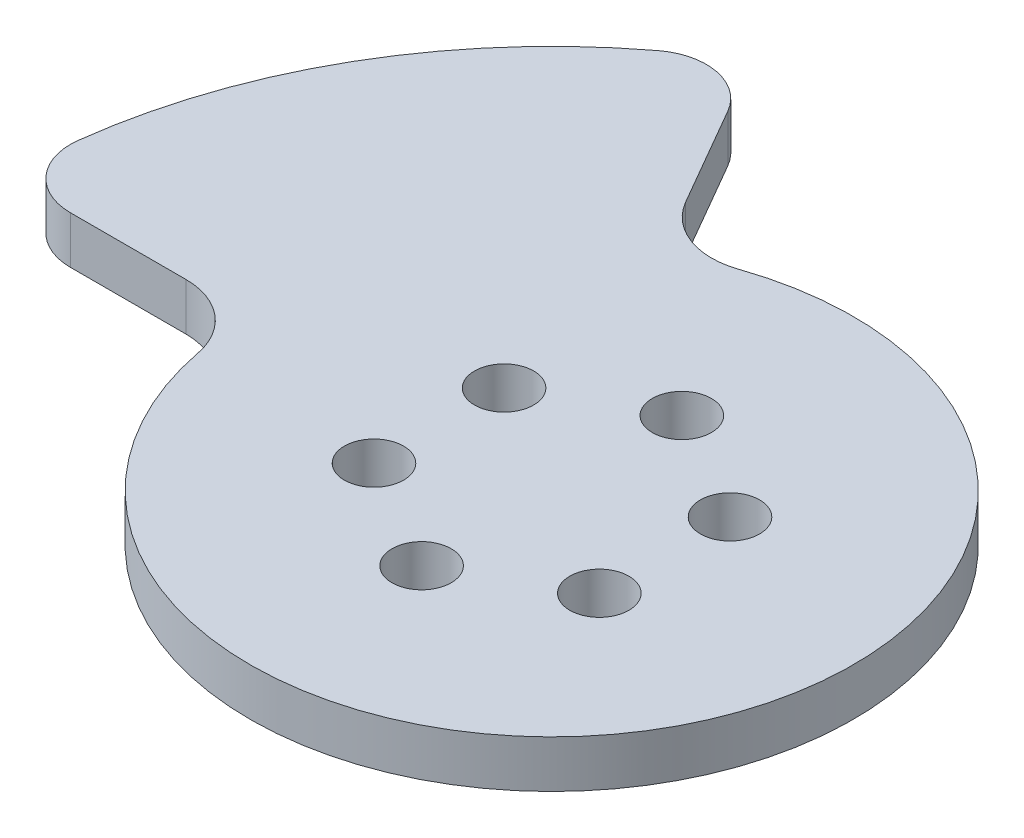
ISO-10303-21;
HEADER;
FILE_DESCRIPTION(('STEP AP214'),'2;1');
FILE_NAME('part.step','',(''),(''),'','','');
FILE_SCHEMA(('AUTOMOTIVE_DESIGN { 1 0 10303 214 1 1 1 1 }'));
ENDSEC;
DATA;
#1=APPLICATION_CONTEXT('core data for automotive mechanical design processes');
#2=APPLICATION_PROTOCOL_DEFINITION('international standard','automotive_design',2000,#1);
#3=PRODUCT_CONTEXT('',#1,'mechanical');
#4=PRODUCT('Part','Part','',(#3));
#5=PRODUCT_RELATED_PRODUCT_CATEGORY('part','',(#4));
#6=PRODUCT_DEFINITION_FORMATION('','',#4);
#7=PRODUCT_DEFINITION_CONTEXT('part definition',#1,'design');
#8=PRODUCT_DEFINITION('design','',#6,#7);
#9=PRODUCT_DEFINITION_SHAPE('','',#8);
#10=(LENGTH_UNIT() NAMED_UNIT(*) SI_UNIT(.MILLI.,.METRE.));
#11=(NAMED_UNIT(*) PLANE_ANGLE_UNIT() SI_UNIT($,.RADIAN.));
#12=(NAMED_UNIT(*) SI_UNIT($,.STERADIAN.) SOLID_ANGLE_UNIT());
#13=UNCERTAINTY_MEASURE_WITH_UNIT(LENGTH_MEASURE(1.E-05),#10,'distance_accuracy_value','');
#14=(GEOMETRIC_REPRESENTATION_CONTEXT(3) GLOBAL_UNCERTAINTY_ASSIGNED_CONTEXT((#13)) GLOBAL_UNIT_ASSIGNED_CONTEXT((#10,
#11,#12)) REPRESENTATION_CONTEXT('',''));
#15=CARTESIAN_POINT('',(0.,0.,0.));
#16=DIRECTION('',(0.,0.,1.));
#17=DIRECTION('',(1.,0.,0.));
#18=AXIS2_PLACEMENT_3D('',#15,#16,#17);
#19=CARTESIAN_POINT('',(-30.9232921921325,4.,6.));
#20=DIRECTION('',(0.,1.,0.));
#21=DIRECTION('',(0.,0.,1.));
#22=AXIS2_PLACEMENT_3D('',#19,#20,#21);
#23=PLANE('',#22);
#24=CARTESIAN_POINT('',(-9.52627944162788,4.,5.4999999999999));
#25=DIRECTION('',(0.,1.,0.));
#26=DIRECTION('',(0.,0.,1.));
#27=AXIS2_PLACEMENT_3D('',#24,#25,#26);
#28=CIRCLE('',#27,2.5);
#29=CARTESIAN_POINT('',(-9.52627944162788,4.,7.9999999999999));
#30=VERTEX_POINT('',#29);
#31=EDGE_CURVE('E237',#30,#30,#28,.T.);
#32=ORIENTED_EDGE('',*,*,#31,.F.);
#33=EDGE_LOOP('',(#32));
#34=FACE_BOUND('',#33,.T.);
#35=CARTESIAN_POINT('',(9.52627944162977,4.,5.4999999999999));
#36=DIRECTION('',(0.,1.,0.));
#37=DIRECTION('',(0.,0.,1.));
#38=AXIS2_PLACEMENT_3D('',#35,#36,#37);
#39=CIRCLE('',#38,2.5);
#40=CARTESIAN_POINT('',(9.52627944162977,4.,7.9999999999999));
#41=VERTEX_POINT('',#40);
#42=EDGE_CURVE('E221',#41,#41,#39,.T.);
#43=ORIENTED_EDGE('',*,*,#42,.F.);
#44=EDGE_LOOP('',(#43));
#45=FACE_BOUND('',#44,.T.);
#46=CARTESIAN_POINT('',(9.46206301637637,4.,-5.60975609756097));
#47=DIRECTION('',(0.,1.,0.));
#48=DIRECTION('',(0.,0.,1.));
#49=AXIS2_PLACEMENT_3D('',#46,#47,#48);
#50=CIRCLE('',#49,2.5);
#51=CARTESIAN_POINT('',(9.46206301637637,4.,-3.10975609756097));
#52=VERTEX_POINT('',#51);
#53=EDGE_CURVE('E146',#52,#52,#50,.T.);
#54=ORIENTED_EDGE('',*,*,#53,.F.);
#55=EDGE_LOOP('',(#54));
#56=FACE_BOUND('',#55,.T.);
#57=CARTESIAN_POINT('',(-30.9232921921325,4.,6.));
#58=DIRECTION('',(0.,-1.,0.));
#59=DIRECTION('',(0.,0.,1.));
#60=AXIS2_PLACEMENT_3D('',#57,#58,#59);
#61=CIRCLE('',#60,6.);
#62=CARTESIAN_POINT('',(-30.9232921921325,4.,0.));
#63=VERTEX_POINT('',#62);
#64=CARTESIAN_POINT('',(-25.0331412983929,4.,4.85714285714287));
#65=VERTEX_POINT('',#64);
#66=EDGE_CURVE('E164',#63,#65,#61,.T.);
#67=ORIENTED_EDGE('',*,*,#66,.T.);
#68=CARTESIAN_POINT('',(0.,4.,0.));
#69=DIRECTION('',(0.,1.,0.));
#70=DIRECTION('',(0.,0.,-1.));
#71=AXIS2_PLACEMENT_3D('',#68,#69,#70);
#72=CIRCLE('',#71,25.5);
#73=CARTESIAN_POINT('',(-8.31016154510075,4.,-24.107907729505));
#74=VERTEX_POINT('',#73);
#75=EDGE_CURVE('E100',#65,#74,#72,.T.);
#76=ORIENTED_EDGE('',*,*,#75,.T.);
#77=CARTESIAN_POINT('',(-10.2654936733598,4.,-29.7803566070356));
#78=DIRECTION('',(0.,-1.,0.));
#79=DIRECTION('',(0.,0.,-1.));
#80=AXIS2_PLACEMENT_3D('',#77,#78,#79);
#81=CIRCLE('',#80,6.);
#82=CARTESIAN_POINT('',(-15.4616460960664,4.,-26.7803566070356));
#83=VERTEX_POINT('',#82);
#84=EDGE_CURVE('E185',#74,#83,#81,.T.);
#85=ORIENTED_EDGE('',*,*,#84,.T.);
#86=DIRECTION('',(-0.500000000000004,0.,-0.866025403784436));
#87=VECTOR('',#86,1.);
#88=CARTESIAN_POINT('',(-20.346989949376,4.,-35.2420203734121));
#89=LINE('',#88,#87);
#90=CARTESIAN_POINT('',(-20.346989949376,4.,-35.2420203734121));
#91=VERTEX_POINT('',#90);
#92=EDGE_CURVE('E199',#83,#91,#89,.T.);
#93=ORIENTED_EDGE('',*,*,#92,.T.);
#94=CARTESIAN_POINT('',(-24.6771169682982,4.,-32.7420203734121));
#95=DIRECTION('',(0.,1.,0.));
#96=DIRECTION('',(0.,0.,-1.));
#97=AXIS2_PLACEMENT_3D('',#94,#95,#96);
#98=CIRCLE('',#97,5.);
#99=CARTESIAN_POINT('',(-27.6865214766272,4.,-36.7349496872428));
#100=VERTEX_POINT('',#99);
#101=EDGE_CURVE('E119',#91,#100,#98,.T.);
#102=ORIENTED_EDGE('',*,*,#101,.T.);
#103=CARTESIAN_POINT('',(9.5062846483529E-13,4.,0.));
#104=DIRECTION('',(0.,1.,0.));
#105=DIRECTION('',(0.,0.,1.));
#106=AXIS2_PLACEMENT_3D('',#103,#104,#105);
#107=CIRCLE('',#106,46.0000000000007);
#108=CARTESIAN_POINT('',(-45.6566603742089,4.,-5.60975609756097));
#109=VERTEX_POINT('',#108);
#110=EDGE_CURVE('E113',#100,#109,#107,.T.);
#111=ORIENTED_EDGE('',*,*,#110,.T.);
#112=CARTESIAN_POINT('',(-40.6939798987516,4.,-5.));
#113=DIRECTION('',(0.,1.,0.));
#114=DIRECTION('',(0.,0.,1.));
#115=AXIS2_PLACEMENT_3D('',#112,#113,#114);
#116=CIRCLE('',#115,4.99999999999999);
#117=CARTESIAN_POINT('',(-40.6939798987516,4.,0.));
#118=VERTEX_POINT('',#117);
#119=EDGE_CURVE('E117',#109,#118,#116,.T.);
#120=ORIENTED_EDGE('',*,*,#119,.T.);
#121=DIRECTION('',(1.,0.,0.));
#122=VECTOR('',#121,1.);
#123=CARTESIAN_POINT('',(-30.9232921921325,4.,0.));
#124=LINE('',#123,#122);
#125=EDGE_CURVE('E57',#118,#63,#124,.T.);
#126=ORIENTED_EDGE('',*,*,#125,.T.);
#127=EDGE_LOOP('',(#67,#76,#85,#93,#102,#111,#120,#126));
#128=FACE_BOUND('',#127,.T.);
#129=CARTESIAN_POINT('',(9.4542429440736E-13,4.,-11.0000000000001));
#130=DIRECTION('',(0.,1.,0.));
#131=DIRECTION('',(0.,0.,1.));
#132=AXIS2_PLACEMENT_3D('',#129,#130,#131);
#133=CIRCLE('',#132,2.5);
#134=CARTESIAN_POINT('',(9.4542429440736E-13,4.,-8.5000000000001));
#135=VERTEX_POINT('',#134);
#136=EDGE_CURVE('E213',#135,#135,#133,.T.);
#137=ORIENTED_EDGE('',*,*,#136,.F.);
#138=EDGE_LOOP('',(#137));
#139=FACE_BOUND('',#138,.T.);
#140=CARTESIAN_POINT('',(9.42948691115118E-13,4.,10.9999999999999));
#141=DIRECTION('',(0.,1.,0.));
#142=DIRECTION('',(0.,0.,1.));
#143=AXIS2_PLACEMENT_3D('',#140,#141,#142);
#144=CIRCLE('',#143,2.5);
#145=CARTESIAN_POINT('',(9.42948691115118E-13,4.,13.4999999999999));
#146=VERTEX_POINT('',#145);
#147=EDGE_CURVE('E229',#146,#146,#144,.T.);
#148=ORIENTED_EDGE('',*,*,#147,.F.);
#149=EDGE_LOOP('',(#148));
#150=FACE_BOUND('',#149,.T.);
#151=CARTESIAN_POINT('',(-9.52627944162788,4.,-5.5000000000001));
#152=DIRECTION('',(0.,1.,0.));
#153=DIRECTION('',(0.,0.,1.));
#154=AXIS2_PLACEMENT_3D('',#151,#152,#153);
#155=CIRCLE('',#154,2.5);
#156=CARTESIAN_POINT('',(-9.52627944162788,4.,-3.0000000000001));
#157=VERTEX_POINT('',#156);
#158=EDGE_CURVE('E245',#157,#157,#155,.T.);
#159=ORIENTED_EDGE('',*,*,#158,.F.);
#160=EDGE_LOOP('',(#159));
#161=FACE_BOUND('',#160,.T.);
#162=ADVANCED_FACE('F39',(#34,#45,#56,#128,#139,#150,#161),#23,.T.);
#163=CARTESIAN_POINT('',(-30.9232921921325,0.,6.));
#164=DIRECTION('',(0.,1.,0.));
#165=DIRECTION('',(0.,0.,1.));
#166=AXIS2_PLACEMENT_3D('',#163,#164,#165);
#167=PLANE('',#166);
#168=CARTESIAN_POINT('',(-30.9232921921325,0.,6.));
#169=DIRECTION('',(0.,-1.,0.));
#170=DIRECTION('',(0.,0.,1.));
#171=AXIS2_PLACEMENT_3D('',#168,#169,#170);
#172=CIRCLE('',#171,6.);
#173=CARTESIAN_POINT('',(-30.9232921921325,0.,0.));
#174=VERTEX_POINT('',#173);
#175=CARTESIAN_POINT('',(-25.0331412983929,0.,4.85714285714287));
#176=VERTEX_POINT('',#175);
#177=EDGE_CURVE('E141',#174,#176,#172,.T.);
#178=ORIENTED_EDGE('',*,*,#177,.F.);
#179=DIRECTION('',(1.,0.,0.));
#180=VECTOR('',#179,1.);
#181=CARTESIAN_POINT('',(-30.9232921921325,0.,0.));
#182=LINE('',#181,#180);
#183=CARTESIAN_POINT('',(-40.6939798987516,0.,0.));
#184=VERTEX_POINT('',#183);
#185=EDGE_CURVE('E92',#184,#174,#182,.T.);
#186=ORIENTED_EDGE('',*,*,#185,.F.);
#187=CARTESIAN_POINT('',(-40.6939798987516,0.,-5.));
#188=DIRECTION('',(0.,1.,0.));
#189=DIRECTION('',(0.,0.,1.));
#190=AXIS2_PLACEMENT_3D('',#187,#188,#189);
#191=CIRCLE('',#190,4.99999999999999);
#192=CARTESIAN_POINT('',(-45.6566603742089,0.,-5.60975609756097));
#193=VERTEX_POINT('',#192);
#194=EDGE_CURVE('E86',#193,#184,#191,.T.);
#195=ORIENTED_EDGE('',*,*,#194,.F.);
#196=CARTESIAN_POINT('',(9.5062846483529E-13,0.,0.));
#197=DIRECTION('',(0.,1.,0.));
#198=DIRECTION('',(0.,0.,1.));
#199=AXIS2_PLACEMENT_3D('',#196,#197,#198);
#200=CIRCLE('',#199,46.0000000000007);
#201=CARTESIAN_POINT('',(-27.6865214766272,0.,-36.7349496872428));
#202=VERTEX_POINT('',#201);
#203=EDGE_CURVE('E128',#202,#193,#200,.T.);
#204=ORIENTED_EDGE('',*,*,#203,.F.);
#205=CARTESIAN_POINT('',(-24.6771169682982,0.,-32.7420203734121));
#206=DIRECTION('',(0.,1.,0.));
#207=DIRECTION('',(0.,0.,-1.));
#208=AXIS2_PLACEMENT_3D('',#205,#206,#207);
#209=CIRCLE('',#208,5.);
#210=CARTESIAN_POINT('',(-20.346989949376,0.,-35.2420203734121));
#211=VERTEX_POINT('',#210);
#212=EDGE_CURVE('E155',#211,#202,#209,.T.);
#213=ORIENTED_EDGE('',*,*,#212,.F.);
#214=DIRECTION('',(-0.500000000000004,0.,-0.866025403784436));
#215=VECTOR('',#214,1.);
#216=CARTESIAN_POINT('',(-20.346989949376,0.,-35.2420203734121));
#217=LINE('',#216,#215);
#218=CARTESIAN_POINT('',(-15.4616460960664,0.,-26.7803566070356));
#219=VERTEX_POINT('',#218);
#220=EDGE_CURVE('E152',#219,#211,#217,.T.);
#221=ORIENTED_EDGE('',*,*,#220,.F.);
#222=CARTESIAN_POINT('',(-10.2654936733598,0.,-29.7803566070356));
#223=DIRECTION('',(0.,-1.,0.));
#224=DIRECTION('',(0.,0.,-1.));
#225=AXIS2_PLACEMENT_3D('',#222,#223,#224);
#226=CIRCLE('',#225,6.);
#227=CARTESIAN_POINT('',(-8.31016154510075,0.,-24.107907729505));
#228=VERTEX_POINT('',#227);
#229=EDGE_CURVE('E149',#228,#219,#226,.T.);
#230=ORIENTED_EDGE('',*,*,#229,.F.);
#231=CARTESIAN_POINT('',(0.,0.,0.));
#232=DIRECTION('',(0.,1.,0.));
#233=DIRECTION('',(0.,0.,-1.));
#234=AXIS2_PLACEMENT_3D('',#231,#232,#233);
#235=CIRCLE('',#234,25.5);
#236=EDGE_CURVE('E145',#176,#228,#235,.T.);
#237=ORIENTED_EDGE('',*,*,#236,.F.);
#238=EDGE_LOOP('',(#178,#186,#195,#204,#213,#221,#230,#237));
#239=FACE_BOUND('',#238,.T.);
#240=CARTESIAN_POINT('',(9.46206301637637,0.,-5.60975609756097));
#241=DIRECTION('',(0.,1.,0.));
#242=DIRECTION('',(0.,0.,1.));
#243=AXIS2_PLACEMENT_3D('',#240,#241,#242);
#244=CIRCLE('',#243,2.5);
#245=CARTESIAN_POINT('',(9.46206301637637,0.,-3.10975609756097));
#246=VERTEX_POINT('',#245);
#247=EDGE_CURVE('E209',#246,#246,#244,.T.);
#248=ORIENTED_EDGE('',*,*,#247,.T.);
#249=EDGE_LOOP('',(#248));
#250=FACE_BOUND('',#249,.T.);
#251=CARTESIAN_POINT('',(9.4542429440736E-13,0.,-11.0000000000001));
#252=DIRECTION('',(0.,1.,0.));
#253=DIRECTION('',(0.,0.,1.));
#254=AXIS2_PLACEMENT_3D('',#251,#252,#253);
#255=CIRCLE('',#254,2.5);
#256=CARTESIAN_POINT('',(9.4542429440736E-13,0.,-8.5000000000001));
#257=VERTEX_POINT('',#256);
#258=EDGE_CURVE('E217',#257,#257,#255,.T.);
#259=ORIENTED_EDGE('',*,*,#258,.T.);
#260=EDGE_LOOP('',(#259));
#261=FACE_BOUND('',#260,.T.);
#262=CARTESIAN_POINT('',(9.52627944162977,0.,5.4999999999999));
#263=DIRECTION('',(0.,1.,0.));
#264=DIRECTION('',(0.,0.,1.));
#265=AXIS2_PLACEMENT_3D('',#262,#263,#264);
#266=CIRCLE('',#265,2.5);
#267=CARTESIAN_POINT('',(9.52627944162977,0.,7.9999999999999));
#268=VERTEX_POINT('',#267);
#269=EDGE_CURVE('E225',#268,#268,#266,.T.);
#270=ORIENTED_EDGE('',*,*,#269,.T.);
#271=EDGE_LOOP('',(#270));
#272=FACE_BOUND('',#271,.T.);
#273=CARTESIAN_POINT('',(9.42948691115118E-13,0.,10.9999999999999));
#274=DIRECTION('',(0.,1.,0.));
#275=DIRECTION('',(0.,0.,1.));
#276=AXIS2_PLACEMENT_3D('',#273,#274,#275);
#277=CIRCLE('',#276,2.5);
#278=CARTESIAN_POINT('',(9.42948691115118E-13,0.,13.4999999999999));
#279=VERTEX_POINT('',#278);
#280=EDGE_CURVE('E233',#279,#279,#277,.T.);
#281=ORIENTED_EDGE('',*,*,#280,.T.);
#282=EDGE_LOOP('',(#281));
#283=FACE_BOUND('',#282,.T.);
#284=CARTESIAN_POINT('',(-9.52627944162788,0.,5.4999999999999));
#285=DIRECTION('',(0.,1.,0.));
#286=DIRECTION('',(0.,0.,1.));
#287=AXIS2_PLACEMENT_3D('',#284,#285,#286);
#288=CIRCLE('',#287,2.5);
#289=CARTESIAN_POINT('',(-9.52627944162788,0.,7.9999999999999));
#290=VERTEX_POINT('',#289);
#291=EDGE_CURVE('E241',#290,#290,#288,.T.);
#292=ORIENTED_EDGE('',*,*,#291,.T.);
#293=EDGE_LOOP('',(#292));
#294=FACE_BOUND('',#293,.T.);
#295=CARTESIAN_POINT('',(-9.52627944162788,0.,-5.5000000000001));
#296=DIRECTION('',(0.,1.,0.));
#297=DIRECTION('',(0.,0.,1.));
#298=AXIS2_PLACEMENT_3D('',#295,#296,#297);
#299=CIRCLE('',#298,2.5);
#300=CARTESIAN_POINT('',(-9.52627944162788,0.,-3.0000000000001));
#301=VERTEX_POINT('',#300);
#302=EDGE_CURVE('E249',#301,#301,#299,.T.);
#303=ORIENTED_EDGE('',*,*,#302,.T.);
#304=EDGE_LOOP('',(#303));
#305=FACE_BOUND('',#304,.T.);
#306=ADVANCED_FACE('F189',(#239,#250,#261,#272,#283,#294,#305),#167,.F.);
#307=CARTESIAN_POINT('',(-30.9232921921325,4.,6.));
#308=DIRECTION('',(0.,-1.,0.));
#309=DIRECTION('',(0.,0.,-1.));
#310=AXIS2_PLACEMENT_3D('',#307,#308,#309);
#311=CYLINDRICAL_SURFACE('',#310,6.);
#312=ORIENTED_EDGE('',*,*,#177,.T.);
#313=DIRECTION('',(0.,-1.,0.));
#314=VECTOR('',#313,1.);
#315=CARTESIAN_POINT('',(-25.0331412983929,4.,4.85714285714287));
#316=LINE('',#315,#314);
#317=EDGE_CURVE('E11',#65,#176,#316,.T.);
#318=ORIENTED_EDGE('',*,*,#317,.F.);
#319=ORIENTED_EDGE('',*,*,#66,.F.);
#320=DIRECTION('',(0.,-1.,0.));
#321=VECTOR('',#320,1.);
#322=CARTESIAN_POINT('',(-30.9232921921325,4.,0.));
#323=LINE('',#322,#321);
#324=EDGE_CURVE('E137',#63,#174,#323,.T.);
#325=ORIENTED_EDGE('',*,*,#324,.T.);
#326=EDGE_LOOP('',(#312,#318,#319,#325));
#327=FACE_BOUND('',#326,.T.);
#328=ADVANCED_FACE('F41',(#327),#311,.F.);
#329=CARTESIAN_POINT('',(0.,4.,0.));
#330=DIRECTION('',(0.,-1.,0.));
#331=DIRECTION('',(0.,0.,-1.));
#332=AXIS2_PLACEMENT_3D('',#329,#330,#331);
#333=CYLINDRICAL_SURFACE('',#332,25.5);
#334=ORIENTED_EDGE('',*,*,#236,.T.);
#335=DIRECTION('',(0.,-1.,0.));
#336=VECTOR('',#335,1.);
#337=CARTESIAN_POINT('',(-8.31016154510075,4.,-24.107907729505));
#338=LINE('',#337,#336);
#339=EDGE_CURVE('E49',#74,#228,#338,.T.);
#340=ORIENTED_EDGE('',*,*,#339,.F.);
#341=ORIENTED_EDGE('',*,*,#75,.F.);
#342=ORIENTED_EDGE('',*,*,#317,.T.);
#343=EDGE_LOOP('',(#334,#340,#341,#342));
#344=FACE_BOUND('',#343,.T.);
#345=ADVANCED_FACE('F285',(#344),#333,.T.);
#346=CARTESIAN_POINT('',(-10.2654936733598,4.,-29.7803566070356));
#347=DIRECTION('',(0.,-1.,0.));
#348=DIRECTION('',(0.,0.,-1.));
#349=AXIS2_PLACEMENT_3D('',#346,#347,#348);
#350=CYLINDRICAL_SURFACE('',#349,6.);
#351=ORIENTED_EDGE('',*,*,#229,.T.);
#352=DIRECTION('',(0.,-1.,0.));
#353=VECTOR('',#352,1.);
#354=CARTESIAN_POINT('',(-15.4616460960664,4.,-26.7803566070356));
#355=LINE('',#354,#353);
#356=EDGE_CURVE('E175',#83,#219,#355,.T.);
#357=ORIENTED_EDGE('',*,*,#356,.F.);
#358=ORIENTED_EDGE('',*,*,#84,.F.);
#359=ORIENTED_EDGE('',*,*,#339,.T.);
#360=EDGE_LOOP('',(#351,#357,#358,#359));
#361=FACE_BOUND('',#360,.T.);
#362=ADVANCED_FACE('F183',(#361),#350,.F.);
#363=CARTESIAN_POINT('',(-20.346989949376,4.,-35.2420203734121));
#364=DIRECTION('',(-0.866025403784436,0.,0.500000000000004));
#365=DIRECTION('',(0.500000000000004,0.,0.866025403784436));
#366=AXIS2_PLACEMENT_3D('',#363,#364,#365);
#367=PLANE('',#366);
#368=ORIENTED_EDGE('',*,*,#220,.T.);
#369=DIRECTION('',(0.,-1.,0.));
#370=VECTOR('',#369,1.);
#371=CARTESIAN_POINT('',(-20.346989949376,4.,-35.2420203734121));
#372=LINE('',#371,#370);
#373=EDGE_CURVE('E171',#91,#211,#372,.T.);
#374=ORIENTED_EDGE('',*,*,#373,.F.);
#375=ORIENTED_EDGE('',*,*,#92,.F.);
#376=ORIENTED_EDGE('',*,*,#356,.T.);
#377=EDGE_LOOP('',(#368,#374,#375,#376));
#378=FACE_BOUND('',#377,.T.);
#379=ADVANCED_FACE('F194',(#378),#367,.F.);
#380=CARTESIAN_POINT('',(-24.6771169682982,4.,-32.7420203734121));
#381=DIRECTION('',(0.,-1.,0.));
#382=DIRECTION('',(0.,0.,-1.));
#383=AXIS2_PLACEMENT_3D('',#380,#381,#382);
#384=CYLINDRICAL_SURFACE('',#383,5.);
#385=ORIENTED_EDGE('',*,*,#212,.T.);
#386=DIRECTION('',(0.,-1.,0.));
#387=VECTOR('',#386,1.);
#388=CARTESIAN_POINT('',(-27.6865214766272,4.,-36.7349496872428));
#389=LINE('',#388,#387);
#390=EDGE_CURVE('E130',#100,#202,#389,.T.);
#391=ORIENTED_EDGE('',*,*,#390,.F.);
#392=ORIENTED_EDGE('',*,*,#101,.F.);
#393=ORIENTED_EDGE('',*,*,#373,.T.);
#394=EDGE_LOOP('',(#385,#391,#392,#393));
#395=FACE_BOUND('',#394,.T.);
#396=ADVANCED_FACE('F197',(#395),#384,.T.);
#397=CARTESIAN_POINT('',(9.5062846483529E-13,4.,0.));
#398=DIRECTION('',(0.,-1.,0.));
#399=DIRECTION('',(0.,0.,-1.));
#400=AXIS2_PLACEMENT_3D('',#397,#398,#399);
#401=CYLINDRICAL_SURFACE('',#400,46.0000000000007);
#402=ORIENTED_EDGE('',*,*,#203,.T.);
#403=DIRECTION('',(0.,-1.,0.));
#404=VECTOR('',#403,1.);
#405=CARTESIAN_POINT('',(-45.6566603742089,4.,-5.60975609756097));
#406=LINE('',#405,#404);
#407=EDGE_CURVE('E125',#109,#193,#406,.T.);
#408=ORIENTED_EDGE('',*,*,#407,.F.);
#409=ORIENTED_EDGE('',*,*,#110,.F.);
#410=ORIENTED_EDGE('',*,*,#390,.T.);
#411=EDGE_LOOP('',(#402,#408,#409,#410));
#412=FACE_BOUND('',#411,.T.);
#413=ADVANCED_FACE('F126',(#412),#401,.T.);
#414=CARTESIAN_POINT('',(-40.6939798987516,4.,-5.));
#415=DIRECTION('',(0.,-1.,0.));
#416=DIRECTION('',(0.,0.,-1.));
#417=AXIS2_PLACEMENT_3D('',#414,#415,#416);
#418=CYLINDRICAL_SURFACE('',#417,4.99999999999999);
#419=ORIENTED_EDGE('',*,*,#194,.T.);
#420=DIRECTION('',(0.,-1.,0.));
#421=VECTOR('',#420,1.);
#422=CARTESIAN_POINT('',(-40.6939798987516,4.,0.));
#423=LINE('',#422,#421);
#424=EDGE_CURVE('E131',#118,#184,#423,.T.);
#425=ORIENTED_EDGE('',*,*,#424,.F.);
#426=ORIENTED_EDGE('',*,*,#119,.F.);
#427=ORIENTED_EDGE('',*,*,#407,.T.);
#428=EDGE_LOOP('',(#419,#425,#426,#427));
#429=FACE_BOUND('',#428,.T.);
#430=ADVANCED_FACE('F133',(#429),#418,.T.);
#431=CARTESIAN_POINT('',(-30.9232921921325,4.,0.));
#432=DIRECTION('',(0.,0.,-1.));
#433=DIRECTION('',(-1.,0.,0.));
#434=AXIS2_PLACEMENT_3D('',#431,#432,#433);
#435=PLANE('',#434);
#436=ORIENTED_EDGE('',*,*,#185,.T.);
#437=ORIENTED_EDGE('',*,*,#324,.F.);
#438=ORIENTED_EDGE('',*,*,#125,.F.);
#439=ORIENTED_EDGE('',*,*,#424,.T.);
#440=EDGE_LOOP('',(#436,#437,#438,#439));
#441=FACE_BOUND('',#440,.T.);
#442=ADVANCED_FACE('F273',(#441),#435,.F.);
#443=CARTESIAN_POINT('',(9.46206301637637,4.,-5.60975609756097));
#444=DIRECTION('',(0.,-1.,0.));
#445=DIRECTION('',(0.,0.,-1.));
#446=AXIS2_PLACEMENT_3D('',#443,#444,#445);
#447=CYLINDRICAL_SURFACE('',#446,2.5);
#448=ORIENTED_EDGE('',*,*,#53,.T.);
#449=EDGE_LOOP('',(#448));
#450=FACE_BOUND('',#449,.T.);
#451=ORIENTED_EDGE('',*,*,#247,.F.);
#452=EDGE_LOOP('',(#451));
#453=FACE_BOUND('',#452,.T.);
#454=ADVANCED_FACE('F270',(#450,#453),#447,.F.);
#455=CARTESIAN_POINT('',(9.4542429440736E-13,4.,-11.0000000000001));
#456=DIRECTION('',(0.,-1.,0.));
#457=DIRECTION('',(0.,0.,-1.));
#458=AXIS2_PLACEMENT_3D('',#455,#456,#457);
#459=CYLINDRICAL_SURFACE('',#458,2.5);
#460=ORIENTED_EDGE('',*,*,#136,.T.);
#461=EDGE_LOOP('',(#460));
#462=FACE_BOUND('',#461,.T.);
#463=ORIENTED_EDGE('',*,*,#258,.F.);
#464=EDGE_LOOP('',(#463));
#465=FACE_BOUND('',#464,.T.);
#466=ADVANCED_FACE('F349',(#462,#465),#459,.F.);
#467=CARTESIAN_POINT('',(9.52627944162977,4.,5.4999999999999));
#468=DIRECTION('',(0.,-1.,0.));
#469=DIRECTION('',(0.,0.,-1.));
#470=AXIS2_PLACEMENT_3D('',#467,#468,#469);
#471=CYLINDRICAL_SURFACE('',#470,2.5);
#472=ORIENTED_EDGE('',*,*,#42,.T.);
#473=EDGE_LOOP('',(#472));
#474=FACE_BOUND('',#473,.T.);
#475=ORIENTED_EDGE('',*,*,#269,.F.);
#476=EDGE_LOOP('',(#475));
#477=FACE_BOUND('',#476,.T.);
#478=ADVANCED_FACE('F357',(#474,#477),#471,.F.);
#479=CARTESIAN_POINT('',(9.42948691115118E-13,4.,10.9999999999999));
#480=DIRECTION('',(0.,-1.,0.));
#481=DIRECTION('',(0.,0.,-1.));
#482=AXIS2_PLACEMENT_3D('',#479,#480,#481);
#483=CYLINDRICAL_SURFACE('',#482,2.5);
#484=ORIENTED_EDGE('',*,*,#147,.T.);
#485=EDGE_LOOP('',(#484));
#486=FACE_BOUND('',#485,.T.);
#487=ORIENTED_EDGE('',*,*,#280,.F.);
#488=EDGE_LOOP('',(#487));
#489=FACE_BOUND('',#488,.T.);
#490=ADVANCED_FACE('F365',(#486,#489),#483,.F.);
#491=CARTESIAN_POINT('',(-9.52627944162788,4.,5.4999999999999));
#492=DIRECTION('',(0.,-1.,0.));
#493=DIRECTION('',(0.,0.,-1.));
#494=AXIS2_PLACEMENT_3D('',#491,#492,#493);
#495=CYLINDRICAL_SURFACE('',#494,2.5);
#496=ORIENTED_EDGE('',*,*,#31,.T.);
#497=EDGE_LOOP('',(#496));
#498=FACE_BOUND('',#497,.T.);
#499=ORIENTED_EDGE('',*,*,#291,.F.);
#500=EDGE_LOOP('',(#499));
#501=FACE_BOUND('',#500,.T.);
#502=ADVANCED_FACE('F374',(#498,#501),#495,.F.);
#503=CARTESIAN_POINT('',(-9.52627944162788,4.,-5.5000000000001));
#504=DIRECTION('',(0.,-1.,0.));
#505=DIRECTION('',(0.,0.,-1.));
#506=AXIS2_PLACEMENT_3D('',#503,#504,#505);
#507=CYLINDRICAL_SURFACE('',#506,2.5);
#508=ORIENTED_EDGE('',*,*,#158,.T.);
#509=EDGE_LOOP('',(#508));
#510=FACE_BOUND('',#509,.T.);
#511=ORIENTED_EDGE('',*,*,#302,.F.);
#512=EDGE_LOOP('',(#511));
#513=FACE_BOUND('',#512,.T.);
#514=ADVANCED_FACE('F257',(#510,#513),#507,.F.);
#515=CLOSED_SHELL('',(#162,#306,#328,#345,#362,#379,#396,#413,#430,#442,#454,#466,#478,#490,
#502,#514));
#516=MANIFOLD_SOLID_BREP('B2',#515);
#517=ADVANCED_BREP_SHAPE_REPRESENTATION('',(#18,#516),#14);
#518=SHAPE_DEFINITION_REPRESENTATION(#9,#517);
ENDSEC;
END-ISO-10303-21;
